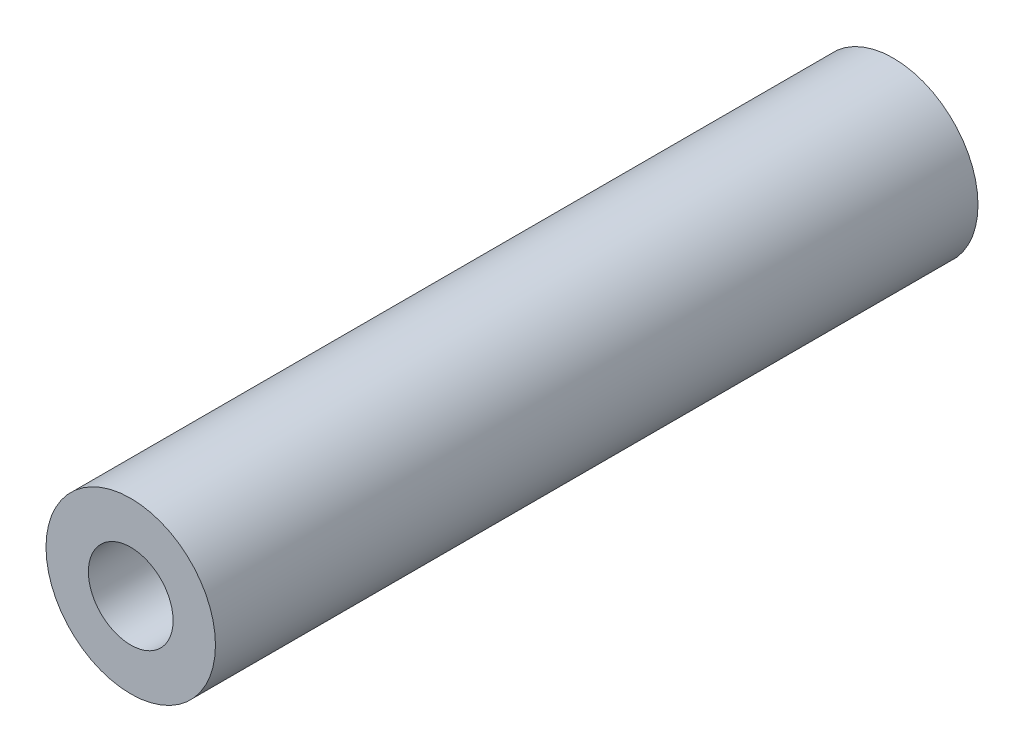
ISO-10303-21;
HEADER;
FILE_DESCRIPTION(('STEP AP214'),'2;1');
FILE_NAME('part.step','',(''),(''),'','','');
FILE_SCHEMA(('AUTOMOTIVE_DESIGN { 1 0 10303 214 1 1 1 1 }'));
ENDSEC;
DATA;
#1=APPLICATION_CONTEXT('core data for automotive mechanical design processes');
#2=APPLICATION_PROTOCOL_DEFINITION('international standard','automotive_design',2000,#1);
#3=PRODUCT_CONTEXT('',#1,'mechanical');
#4=PRODUCT('Part','Part','',(#3));
#5=PRODUCT_RELATED_PRODUCT_CATEGORY('part','',(#4));
#6=PRODUCT_DEFINITION_FORMATION('','',#4);
#7=PRODUCT_DEFINITION_CONTEXT('part definition',#1,'design');
#8=PRODUCT_DEFINITION('design','',#6,#7);
#9=PRODUCT_DEFINITION_SHAPE('','',#8);
#10=(LENGTH_UNIT() NAMED_UNIT(*) SI_UNIT(.MILLI.,.METRE.));
#11=(NAMED_UNIT(*) PLANE_ANGLE_UNIT() SI_UNIT($,.RADIAN.));
#12=(NAMED_UNIT(*) SI_UNIT($,.STERADIAN.) SOLID_ANGLE_UNIT());
#13=UNCERTAINTY_MEASURE_WITH_UNIT(LENGTH_MEASURE(1.E-05),#10,'distance_accuracy_value','');
#14=(GEOMETRIC_REPRESENTATION_CONTEXT(3) GLOBAL_UNCERTAINTY_ASSIGNED_CONTEXT((#13)) GLOBAL_UNIT_ASSIGNED_CONTEXT((#10,
#11,#12)) REPRESENTATION_CONTEXT('',''));
#15=CARTESIAN_POINT('',(0.,0.,0.));
#16=DIRECTION('',(0.,0.,1.));
#17=DIRECTION('',(1.,0.,0.));
#18=AXIS2_PLACEMENT_3D('',#15,#16,#17);
#19=CARTESIAN_POINT('',(0.,0.,228.6));
#20=DIRECTION('',(0.,0.,1.));
#21=DIRECTION('',(1.,0.,0.));
#22=AXIS2_PLACEMENT_3D('',#19,#20,#21);
#23=PLANE('',#22);
#24=CARTESIAN_POINT('',(0.,0.,228.6));
#25=DIRECTION('',(0.,0.,1.));
#26=DIRECTION('',(1.,0.,0.));
#27=AXIS2_PLACEMENT_3D('',#24,#25,#26);
#28=CIRCLE('',#27,25.4);
#29=CARTESIAN_POINT('',(25.4,0.,228.6));
#30=VERTEX_POINT('',#29);
#31=EDGE_CURVE('E10',#30,#30,#28,.T.);
#32=ORIENTED_EDGE('',*,*,#31,.T.);
#33=EDGE_LOOP('',(#32));
#34=FACE_BOUND('',#33,.T.);
#35=CARTESIAN_POINT('',(0.,0.,228.6));
#36=DIRECTION('',(0.,0.,1.));
#37=DIRECTION('',(1.,0.,0.));
#38=AXIS2_PLACEMENT_3D('',#35,#36,#37);
#39=CIRCLE('',#38,12.7);
#40=CARTESIAN_POINT('',(12.7,0.,228.6));
#41=VERTEX_POINT('',#40);
#42=EDGE_CURVE('E54',#41,#41,#39,.T.);
#43=ORIENTED_EDGE('',*,*,#42,.F.);
#44=EDGE_LOOP('',(#43));
#45=FACE_BOUND('',#44,.T.);
#46=ADVANCED_FACE('F41',(#34,#45),#23,.T.);
#47=CARTESIAN_POINT('',(0.,0.,0.));
#48=DIRECTION('',(0.,0.,1.));
#49=DIRECTION('',(1.,0.,0.));
#50=AXIS2_PLACEMENT_3D('',#47,#48,#49);
#51=PLANE('',#50);
#52=CARTESIAN_POINT('',(0.,0.,0.));
#53=DIRECTION('',(0.,0.,1.));
#54=DIRECTION('',(1.,0.,0.));
#55=AXIS2_PLACEMENT_3D('',#52,#53,#54);
#56=CIRCLE('',#55,25.4);
#57=CARTESIAN_POINT('',(25.4,0.,0.));
#58=VERTEX_POINT('',#57);
#59=EDGE_CURVE('E45',#58,#58,#56,.T.);
#60=ORIENTED_EDGE('',*,*,#59,.F.);
#61=EDGE_LOOP('',(#60));
#62=FACE_BOUND('',#61,.T.);
#63=CARTESIAN_POINT('',(0.,0.,0.));
#64=DIRECTION('',(0.,0.,1.));
#65=DIRECTION('',(1.,0.,0.));
#66=AXIS2_PLACEMENT_3D('',#63,#64,#65);
#67=CIRCLE('',#66,12.7);
#68=CARTESIAN_POINT('',(12.7,0.,0.));
#69=VERTEX_POINT('',#68);
#70=EDGE_CURVE('E56',#69,#69,#67,.T.);
#71=ORIENTED_EDGE('',*,*,#70,.T.);
#72=EDGE_LOOP('',(#71));
#73=FACE_BOUND('',#72,.T.);
#74=ADVANCED_FACE('F68',(#62,#73),#51,.F.);
#75=CARTESIAN_POINT('',(0.,0.,228.6));
#76=DIRECTION('',(0.,0.,-1.));
#77=DIRECTION('',(-1.,0.,0.));
#78=AXIS2_PLACEMENT_3D('',#75,#76,#77);
#79=CYLINDRICAL_SURFACE('',#78,25.4);
#80=ORIENTED_EDGE('',*,*,#31,.F.);
#81=EDGE_LOOP('',(#80));
#82=FACE_BOUND('',#81,.T.);
#83=ORIENTED_EDGE('',*,*,#59,.T.);
#84=EDGE_LOOP('',(#83));
#85=FACE_BOUND('',#84,.T.);
#86=ADVANCED_FACE('F43',(#82,#85),#79,.T.);
#87=CARTESIAN_POINT('',(0.,0.,228.6));
#88=DIRECTION('',(0.,0.,-1.));
#89=DIRECTION('',(-1.,0.,0.));
#90=AXIS2_PLACEMENT_3D('',#87,#88,#89);
#91=CYLINDRICAL_SURFACE('',#90,12.7);
#92=ORIENTED_EDGE('',*,*,#42,.T.);
#93=EDGE_LOOP('',(#92));
#94=FACE_BOUND('',#93,.T.);
#95=ORIENTED_EDGE('',*,*,#70,.F.);
#96=EDGE_LOOP('',(#95));
#97=FACE_BOUND('',#96,.T.);
#98=ADVANCED_FACE('F64',(#94,#97),#91,.F.);
#99=CLOSED_SHELL('',(#46,#74,#86,#98));
#100=MANIFOLD_SOLID_BREP('B2',#99);
#101=ADVANCED_BREP_SHAPE_REPRESENTATION('',(#18,#100),#14);
#102=SHAPE_DEFINITION_REPRESENTATION(#9,#101);
ENDSEC;
END-ISO-10303-21;
